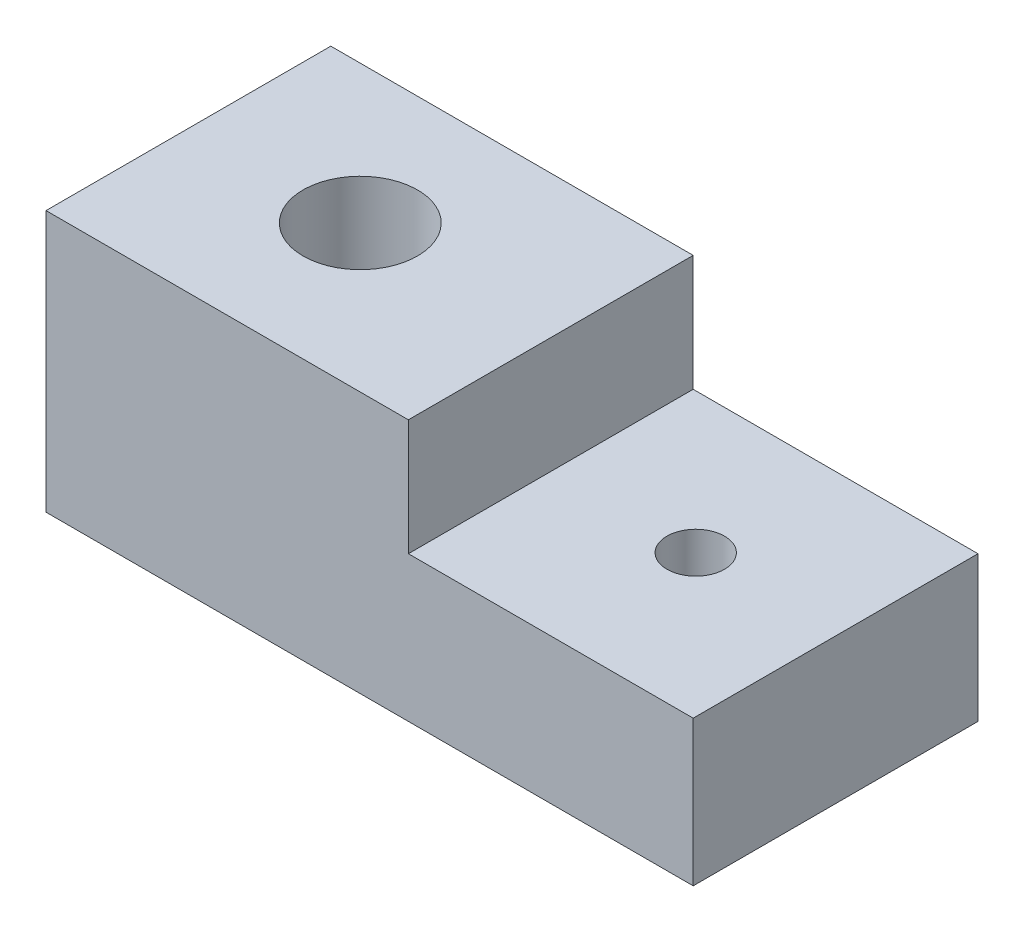
ISO-10303-21;
HEADER;
FILE_DESCRIPTION(('STEP AP214'),'2;1');
FILE_NAME('part.step','',(''),(''),'','','');
FILE_SCHEMA(('AUTOMOTIVE_DESIGN { 1 0 10303 214 1 1 1 1 }'));
ENDSEC;
DATA;
#1=APPLICATION_CONTEXT('core data for automotive mechanical design processes');
#2=APPLICATION_PROTOCOL_DEFINITION('international standard','automotive_design',2000,#1);
#3=PRODUCT_CONTEXT('',#1,'mechanical');
#4=PRODUCT('Part','Part','',(#3));
#5=PRODUCT_RELATED_PRODUCT_CATEGORY('part','',(#4));
#6=PRODUCT_DEFINITION_FORMATION('','',#4);
#7=PRODUCT_DEFINITION_CONTEXT('part definition',#1,'design');
#8=PRODUCT_DEFINITION('design','',#6,#7);
#9=PRODUCT_DEFINITION_SHAPE('','',#8);
#10=(LENGTH_UNIT() NAMED_UNIT(*) SI_UNIT(.MILLI.,.METRE.));
#11=(NAMED_UNIT(*) PLANE_ANGLE_UNIT() SI_UNIT($,.RADIAN.));
#12=(NAMED_UNIT(*) SI_UNIT($,.STERADIAN.) SOLID_ANGLE_UNIT());
#13=UNCERTAINTY_MEASURE_WITH_UNIT(LENGTH_MEASURE(1.E-05),#10,'distance_accuracy_value','');
#14=(GEOMETRIC_REPRESENTATION_CONTEXT(3) GLOBAL_UNCERTAINTY_ASSIGNED_CONTEXT((#13)) GLOBAL_UNIT_ASSIGNED_CONTEXT((#10,
#11,#12)) REPRESENTATION_CONTEXT('',''));
#15=CARTESIAN_POINT('',(0.,0.,0.));
#16=DIRECTION('',(0.,0.,1.));
#17=DIRECTION('',(1.,0.,0.));
#18=AXIS2_PLACEMENT_3D('',#15,#16,#17);
#19=CARTESIAN_POINT('',(127.235427394439,0.,100.));
#20=DIRECTION('',(-1.,0.,0.));
#21=DIRECTION('',(0.,0.,1.));
#22=AXIS2_PLACEMENT_3D('',#19,#20,#21);
#23=PLANE('',#22);
#24=DIRECTION('',(0.,0.,1.));
#25=VECTOR('',#24,1.);
#26=CARTESIAN_POINT('',(127.235427394439,50.9963463678281,100.));
#27=LINE('',#26,#25);
#28=CARTESIAN_POINT('',(127.235427394439,50.9963463678281,0.));
#29=VERTEX_POINT('',#28);
#30=CARTESIAN_POINT('',(127.235427394439,50.9963463678281,100.));
#31=VERTEX_POINT('',#30);
#32=EDGE_CURVE('E61',#29,#31,#27,.T.);
#33=ORIENTED_EDGE('',*,*,#32,.F.);
#34=DIRECTION('',(0.,1.,0.));
#35=VECTOR('',#34,1.);
#36=CARTESIAN_POINT('',(127.235427394439,0.,0.));
#37=LINE('',#36,#35);
#38=CARTESIAN_POINT('',(127.235427394439,91.7195233191114,0.));
#39=VERTEX_POINT('',#38);
#40=EDGE_CURVE('E161',#29,#39,#37,.T.);
#41=ORIENTED_EDGE('',*,*,#40,.T.);
#42=DIRECTION('',(0.,0.,-1.));
#43=VECTOR('',#42,1.);
#44=CARTESIAN_POINT('',(127.235427394439,91.7195233191114,100.));
#45=LINE('',#44,#43);
#46=CARTESIAN_POINT('',(127.235427394439,91.7195233191114,100.));
#47=VERTEX_POINT('',#46);
#48=EDGE_CURVE('E54',#47,#39,#45,.T.);
#49=ORIENTED_EDGE('',*,*,#48,.F.);
#50=DIRECTION('',(0.,1.,0.));
#51=VECTOR('',#50,1.);
#52=CARTESIAN_POINT('',(127.235427394439,0.,100.));
#53=LINE('',#52,#51);
#54=EDGE_CURVE('E114',#31,#47,#53,.T.);
#55=ORIENTED_EDGE('',*,*,#54,.F.);
#56=EDGE_LOOP('',(#33,#41,#49,#55));
#57=FACE_BOUND('',#56,.T.);
#58=ADVANCED_FACE('F45',(#57),#23,.F.);
#59=CARTESIAN_POINT('',(0.,0.,100.));
#60=DIRECTION('',(1.,0.,0.));
#61=DIRECTION('',(0.,0.,-1.));
#62=AXIS2_PLACEMENT_3D('',#59,#60,#61);
#63=PLANE('',#62);
#64=DIRECTION('',(0.,-1.,0.));
#65=VECTOR('',#64,1.);
#66=CARTESIAN_POINT('',(0.,0.,0.));
#67=LINE('',#66,#65);
#68=CARTESIAN_POINT('',(0.,91.7195233191114,0.));
#69=VERTEX_POINT('',#68);
#70=CARTESIAN_POINT('',(0.,0.,0.));
#71=VERTEX_POINT('',#70);
#72=EDGE_CURVE('E148',#69,#71,#67,.T.);
#73=ORIENTED_EDGE('',*,*,#72,.T.);
#74=DIRECTION('',(0.,0.,-1.));
#75=VECTOR('',#74,1.);
#76=CARTESIAN_POINT('',(0.,0.,100.));
#77=LINE('',#76,#75);
#78=CARTESIAN_POINT('',(0.,0.,100.));
#79=VERTEX_POINT('',#78);
#80=EDGE_CURVE('E11',#79,#71,#77,.T.);
#81=ORIENTED_EDGE('',*,*,#80,.F.);
#82=DIRECTION('',(0.,-1.,0.));
#83=VECTOR('',#82,1.);
#84=CARTESIAN_POINT('',(0.,0.,100.));
#85=LINE('',#84,#83);
#86=CARTESIAN_POINT('',(0.,91.7195233191114,100.));
#87=VERTEX_POINT('',#86);
#88=EDGE_CURVE('E111',#87,#79,#85,.T.);
#89=ORIENTED_EDGE('',*,*,#88,.F.);
#90=DIRECTION('',(0.,0.,-1.));
#91=VECTOR('',#90,1.);
#92=CARTESIAN_POINT('',(0.,91.7195233191114,100.));
#93=LINE('',#92,#91);
#94=EDGE_CURVE('E155',#87,#69,#93,.T.);
#95=ORIENTED_EDGE('',*,*,#94,.T.);
#96=EDGE_LOOP('',(#73,#81,#89,#95));
#97=FACE_BOUND('',#96,.T.);
#98=ADVANCED_FACE('F47',(#97),#63,.F.);
#99=CARTESIAN_POINT('',(0.,0.,100.));
#100=DIRECTION('',(0.,1.,0.));
#101=DIRECTION('',(0.,0.,1.));
#102=AXIS2_PLACEMENT_3D('',#99,#100,#101);
#103=PLANE('',#102);
#104=CARTESIAN_POINT('',(58.9382719296726,0.,48.5951922075528));
#105=DIRECTION('',(0.,1.,0.));
#106=DIRECTION('',(0.,0.,1.));
#107=AXIS2_PLACEMENT_3D('',#104,#105,#106);
#108=CIRCLE('',#107,20.1);
#109=CARTESIAN_POINT('',(58.9382719296726,0.,68.6951922075528));
#110=VERTEX_POINT('',#109);
#111=EDGE_CURVE('E210',#110,#110,#108,.T.);
#112=ORIENTED_EDGE('',*,*,#111,.T.);
#113=EDGE_LOOP('',(#112));
#114=FACE_BOUND('',#113,.T.);
#115=CARTESIAN_POINT('',(177.37437504673,0.,49.2435650348363));
#116=DIRECTION('',(0.,1.,0.));
#117=DIRECTION('',(0.,0.,1.));
#118=AXIS2_PLACEMENT_3D('',#115,#116,#117);
#119=CIRCLE('',#118,10.1);
#120=CARTESIAN_POINT('',(177.37437504673,0.,59.3435650348363));
#121=VERTEX_POINT('',#120);
#122=EDGE_CURVE('E132',#121,#121,#119,.T.);
#123=ORIENTED_EDGE('',*,*,#122,.T.);
#124=EDGE_LOOP('',(#123));
#125=FACE_BOUND('',#124,.T.);
#126=DIRECTION('',(1.,0.,0.));
#127=VECTOR('',#126,1.);
#128=CARTESIAN_POINT('',(0.,0.,0.));
#129=LINE('',#128,#127);
#130=CARTESIAN_POINT('',(227.235427394439,0.,0.));
#131=VERTEX_POINT('',#130);
#132=EDGE_CURVE('E119',#71,#131,#129,.T.);
#133=ORIENTED_EDGE('',*,*,#132,.T.);
#134=DIRECTION('',(0.,0.,-1.));
#135=VECTOR('',#134,1.);
#136=CARTESIAN_POINT('',(227.235427394439,0.,100.));
#137=LINE('',#136,#135);
#138=CARTESIAN_POINT('',(227.235427394439,0.,100.));
#139=VERTEX_POINT('',#138);
#140=EDGE_CURVE('E117',#139,#131,#137,.T.);
#141=ORIENTED_EDGE('',*,*,#140,.F.);
#142=DIRECTION('',(1.,0.,0.));
#143=VECTOR('',#142,1.);
#144=CARTESIAN_POINT('',(0.,0.,100.));
#145=LINE('',#144,#143);
#146=EDGE_CURVE('E92',#79,#139,#145,.T.);
#147=ORIENTED_EDGE('',*,*,#146,.F.);
#148=ORIENTED_EDGE('',*,*,#80,.T.);
#149=EDGE_LOOP('',(#133,#141,#147,#148));
#150=FACE_BOUND('',#149,.T.);
#151=ADVANCED_FACE('F118',(#114,#125,#150),#103,.F.);
#152=CARTESIAN_POINT('',(0.,91.7195233191114,100.));
#153=DIRECTION('',(0.,-1.,0.));
#154=DIRECTION('',(0.,0.,-1.));
#155=AXIS2_PLACEMENT_3D('',#152,#153,#154);
#156=PLANE('',#155);
#157=CARTESIAN_POINT('',(58.9382719296726,91.7195233191114,48.5951922075528));
#158=DIRECTION('',(0.,1.,0.));
#159=DIRECTION('',(0.,0.,1.));
#160=AXIS2_PLACEMENT_3D('',#157,#158,#159);
#161=CIRCLE('',#160,20.1);
#162=CARTESIAN_POINT('',(58.9382719296726,91.7195233191114,68.6951922075528));
#163=VERTEX_POINT('',#162);
#164=EDGE_CURVE('E213',#163,#163,#161,.T.);
#165=ORIENTED_EDGE('',*,*,#164,.F.);
#166=EDGE_LOOP('',(#165));
#167=FACE_BOUND('',#166,.T.);
#168=DIRECTION('',(-1.,0.,0.));
#169=VECTOR('',#168,1.);
#170=CARTESIAN_POINT('',(0.,91.7195233191114,0.));
#171=LINE('',#170,#169);
#172=EDGE_CURVE('E86',#39,#69,#171,.T.);
#173=ORIENTED_EDGE('',*,*,#172,.T.);
#174=ORIENTED_EDGE('',*,*,#94,.F.);
#175=DIRECTION('',(-1.,0.,0.));
#176=VECTOR('',#175,1.);
#177=CARTESIAN_POINT('',(0.,91.7195233191114,100.));
#178=LINE('',#177,#176);
#179=EDGE_CURVE('E70',#47,#87,#178,.T.);
#180=ORIENTED_EDGE('',*,*,#179,.F.);
#181=ORIENTED_EDGE('',*,*,#48,.T.);
#182=EDGE_LOOP('',(#173,#174,#180,#181));
#183=FACE_BOUND('',#182,.T.);
#184=ADVANCED_FACE('F169',(#167,#183),#156,.F.);
#185=CARTESIAN_POINT('',(0.,0.,100.));
#186=DIRECTION('',(0.,0.,-1.));
#187=DIRECTION('',(-1.,0.,0.));
#188=AXIS2_PLACEMENT_3D('',#185,#186,#187);
#189=PLANE('',#188);
#190=ORIENTED_EDGE('',*,*,#88,.T.);
#191=ORIENTED_EDGE('',*,*,#146,.T.);
#192=DIRECTION('',(0.,-1.,0.));
#193=VECTOR('',#192,1.);
#194=CARTESIAN_POINT('',(227.235427394439,50.9963463678281,100.));
#195=LINE('',#194,#193);
#196=CARTESIAN_POINT('',(227.235427394439,50.9963463678281,100.));
#197=VERTEX_POINT('',#196);
#198=EDGE_CURVE('E109',#197,#139,#195,.T.);
#199=ORIENTED_EDGE('',*,*,#198,.F.);
#200=DIRECTION('',(-1.,0.,0.));
#201=VECTOR('',#200,1.);
#202=CARTESIAN_POINT('',(227.235427394439,50.9963463678281,100.));
#203=LINE('',#202,#201);
#204=EDGE_CURVE('E140',#197,#31,#203,.T.);
#205=ORIENTED_EDGE('',*,*,#204,.T.);
#206=ORIENTED_EDGE('',*,*,#54,.T.);
#207=ORIENTED_EDGE('',*,*,#179,.T.);
#208=EDGE_LOOP('',(#190,#191,#199,#205,#206,#207));
#209=FACE_BOUND('',#208,.T.);
#210=ADVANCED_FACE('F106',(#209),#189,.F.);
#211=CARTESIAN_POINT('',(0.,0.,0.));
#212=DIRECTION('',(0.,0.,-1.));
#213=DIRECTION('',(-1.,0.,0.));
#214=AXIS2_PLACEMENT_3D('',#211,#212,#213);
#215=PLANE('',#214);
#216=ORIENTED_EDGE('',*,*,#72,.F.);
#217=ORIENTED_EDGE('',*,*,#172,.F.);
#218=ORIENTED_EDGE('',*,*,#40,.F.);
#219=DIRECTION('',(-1.,0.,0.));
#220=VECTOR('',#219,1.);
#221=CARTESIAN_POINT('',(227.235427394439,50.9963463678281,0.));
#222=LINE('',#221,#220);
#223=CARTESIAN_POINT('',(227.235427394439,50.9963463678281,0.));
#224=VERTEX_POINT('',#223);
#225=EDGE_CURVE('E144',#224,#29,#222,.T.);
#226=ORIENTED_EDGE('',*,*,#225,.F.);
#227=DIRECTION('',(0.,1.,0.));
#228=VECTOR('',#227,1.);
#229=CARTESIAN_POINT('',(227.235427394439,50.9963463678281,0.));
#230=LINE('',#229,#228);
#231=EDGE_CURVE('E123',#131,#224,#230,.T.);
#232=ORIENTED_EDGE('',*,*,#231,.F.);
#233=ORIENTED_EDGE('',*,*,#132,.F.);
#234=EDGE_LOOP('',(#216,#217,#218,#226,#232,#233));
#235=FACE_BOUND('',#234,.T.);
#236=ADVANCED_FACE('F172',(#235),#215,.T.);
#237=CARTESIAN_POINT('',(227.235427394439,50.9963463678281,100.));
#238=DIRECTION('',(0.,-1.,0.));
#239=DIRECTION('',(0.,0.,-1.));
#240=AXIS2_PLACEMENT_3D('',#237,#238,#239);
#241=PLANE('',#240);
#242=CARTESIAN_POINT('',(177.37437504673,50.9963463678281,49.2435650348363));
#243=DIRECTION('',(0.,1.,0.));
#244=DIRECTION('',(0.,0.,1.));
#245=AXIS2_PLACEMENT_3D('',#242,#243,#244);
#246=CIRCLE('',#245,10.1);
#247=CARTESIAN_POINT('',(177.37437504673,50.9963463678281,59.3435650348363));
#248=VERTEX_POINT('',#247);
#249=EDGE_CURVE('E217',#248,#248,#246,.T.);
#250=ORIENTED_EDGE('',*,*,#249,.F.);
#251=EDGE_LOOP('',(#250));
#252=FACE_BOUND('',#251,.T.);
#253=ORIENTED_EDGE('',*,*,#32,.T.);
#254=ORIENTED_EDGE('',*,*,#204,.F.);
#255=DIRECTION('',(0.,0.,1.));
#256=VECTOR('',#255,1.);
#257=CARTESIAN_POINT('',(227.235427394439,50.9963463678281,100.));
#258=LINE('',#257,#256);
#259=EDGE_CURVE('E127',#224,#197,#258,.T.);
#260=ORIENTED_EDGE('',*,*,#259,.F.);
#261=ORIENTED_EDGE('',*,*,#225,.T.);
#262=EDGE_LOOP('',(#253,#254,#260,#261));
#263=FACE_BOUND('',#262,.T.);
#264=ADVANCED_FACE('F191',(#252,#263),#241,.F.);
#265=CARTESIAN_POINT('',(227.235427394439,0.,0.));
#266=DIRECTION('',(1.,0.,0.));
#267=DIRECTION('',(0.,0.,-1.));
#268=AXIS2_PLACEMENT_3D('',#265,#266,#267);
#269=PLANE('',#268);
#270=ORIENTED_EDGE('',*,*,#198,.T.);
#271=ORIENTED_EDGE('',*,*,#140,.T.);
#272=ORIENTED_EDGE('',*,*,#231,.T.);
#273=ORIENTED_EDGE('',*,*,#259,.T.);
#274=EDGE_LOOP('',(#270,#271,#272,#273));
#275=FACE_BOUND('',#274,.T.);
#276=ADVANCED_FACE('F125',(#275),#269,.T.);
#277=CARTESIAN_POINT('',(177.37437504673,50.9963463678281,49.2435650348363));
#278=DIRECTION('',(0.,1.,0.));
#279=DIRECTION('',(0.,0.,1.));
#280=AXIS2_PLACEMENT_3D('',#277,#278,#279);
#281=CYLINDRICAL_SURFACE('',#280,10.1);
#282=ORIENTED_EDGE('',*,*,#122,.F.);
#283=EDGE_LOOP('',(#282));
#284=FACE_BOUND('',#283,.T.);
#285=ORIENTED_EDGE('',*,*,#249,.T.);
#286=EDGE_LOOP('',(#285));
#287=FACE_BOUND('',#286,.T.);
#288=ADVANCED_FACE('F198',(#284,#287),#281,.F.);
#289=CARTESIAN_POINT('',(58.9382719296726,91.7195233191114,48.5951922075528));
#290=DIRECTION('',(0.,1.,0.));
#291=DIRECTION('',(0.,0.,1.));
#292=AXIS2_PLACEMENT_3D('',#289,#290,#291);
#293=CYLINDRICAL_SURFACE('',#292,20.1);
#294=ORIENTED_EDGE('',*,*,#111,.F.);
#295=EDGE_LOOP('',(#294));
#296=FACE_BOUND('',#295,.T.);
#297=ORIENTED_EDGE('',*,*,#164,.T.);
#298=EDGE_LOOP('',(#297));
#299=FACE_BOUND('',#298,.T.);
#300=ADVANCED_FACE('F201',(#296,#299),#293,.F.);
#301=CLOSED_SHELL('',(#58,#98,#151,#184,#210,#236,#264,#276,#288,#300));
#302=MANIFOLD_SOLID_BREP('B2',#301);
#303=ADVANCED_BREP_SHAPE_REPRESENTATION('',(#18,#302),#14);
#304=SHAPE_DEFINITION_REPRESENTATION(#9,#303);
ENDSEC;
END-ISO-10303-21;
